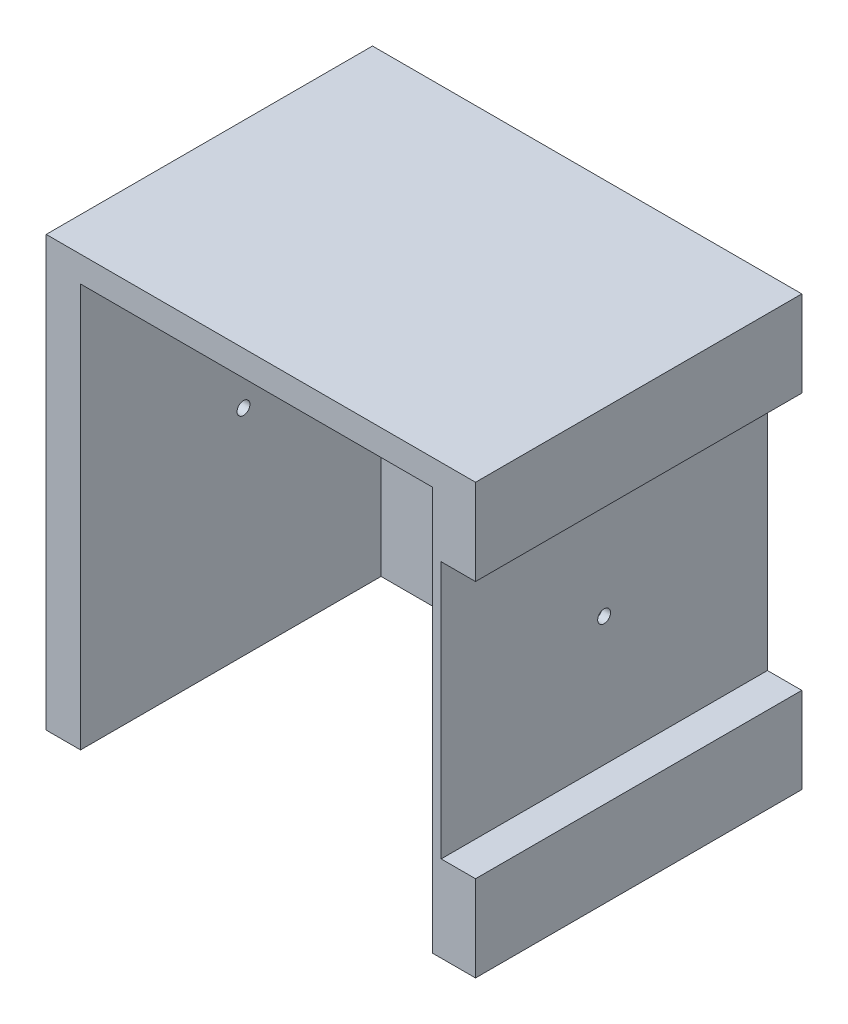
ISO-10303-21;
HEADER;
FILE_DESCRIPTION(('STEP AP214'),'2;1');
FILE_NAME('part.step','',(''),(''),'','','');
FILE_SCHEMA(('AUTOMOTIVE_DESIGN { 1 0 10303 214 1 1 1 1 }'));
ENDSEC;
DATA;
#1=APPLICATION_CONTEXT('core data for automotive mechanical design processes');
#2=APPLICATION_PROTOCOL_DEFINITION('international standard','automotive_design',2000,#1);
#3=PRODUCT_CONTEXT('',#1,'mechanical');
#4=PRODUCT('Part','Part','',(#3));
#5=PRODUCT_RELATED_PRODUCT_CATEGORY('part','',(#4));
#6=PRODUCT_DEFINITION_FORMATION('','',#4);
#7=PRODUCT_DEFINITION_CONTEXT('part definition',#1,'design');
#8=PRODUCT_DEFINITION('design','',#6,#7);
#9=PRODUCT_DEFINITION_SHAPE('','',#8);
#10=(LENGTH_UNIT() NAMED_UNIT(*) SI_UNIT(.MILLI.,.METRE.));
#11=(NAMED_UNIT(*) PLANE_ANGLE_UNIT() SI_UNIT($,.RADIAN.));
#12=(NAMED_UNIT(*) SI_UNIT($,.STERADIAN.) SOLID_ANGLE_UNIT());
#13=UNCERTAINTY_MEASURE_WITH_UNIT(LENGTH_MEASURE(1.E-05),#10,'distance_accuracy_value','');
#14=(GEOMETRIC_REPRESENTATION_CONTEXT(3) GLOBAL_UNCERTAINTY_ASSIGNED_CONTEXT((#13)) GLOBAL_UNIT_ASSIGNED_CONTEXT((#10,
#11,#12)) REPRESENTATION_CONTEXT('',''));
#15=CARTESIAN_POINT('',(0.,0.,0.));
#16=DIRECTION('',(0.,0.,1.));
#17=DIRECTION('',(1.,0.,0.));
#18=AXIS2_PLACEMENT_3D('',#15,#16,#17);
#19=CARTESIAN_POINT('',(25.,25.,3.));
#20=DIRECTION('',(-1.,0.,0.));
#21=DIRECTION('',(0.,-1.,0.));
#22=AXIS2_PLACEMENT_3D('',#19,#20,#21);
#23=PLANE('',#22);
#24=DIRECTION('',(0.,0.,-1.));
#25=VECTOR('',#24,1.);
#26=CARTESIAN_POINT('',(25.,14.9878324931505,0.));
#27=LINE('',#26,#25);
#28=CARTESIAN_POINT('',(25.,14.9878324931505,38.));
#29=VERTEX_POINT('',#28);
#30=CARTESIAN_POINT('',(25.,14.9878324931505,0.));
#31=VERTEX_POINT('',#30);
#32=EDGE_CURVE('E143',#29,#31,#27,.T.);
#33=ORIENTED_EDGE('',*,*,#32,.T.);
#34=DIRECTION('',(0.,1.,0.));
#35=VECTOR('',#34,1.);
#36=CARTESIAN_POINT('',(25.,25.,0.));
#37=LINE('',#36,#35);
#38=CARTESIAN_POINT('',(25.,25.,0.));
#39=VERTEX_POINT('',#38);
#40=EDGE_CURVE('E191',#31,#39,#37,.T.);
#41=ORIENTED_EDGE('',*,*,#40,.T.);
#42=DIRECTION('',(0.,0.,-1.));
#43=VECTOR('',#42,1.);
#44=CARTESIAN_POINT('',(25.,25.,3.));
#45=LINE('',#44,#43);
#46=CARTESIAN_POINT('',(25.,25.,38.));
#47=VERTEX_POINT('',#46);
#48=EDGE_CURVE('E46',#47,#39,#45,.T.);
#49=ORIENTED_EDGE('',*,*,#48,.F.);
#50=DIRECTION('',(0.,-1.,0.));
#51=VECTOR('',#50,1.);
#52=CARTESIAN_POINT('',(25.,25.,38.));
#53=LINE('',#52,#51);
#54=EDGE_CURVE('E179',#47,#29,#53,.T.);
#55=ORIENTED_EDGE('',*,*,#54,.T.);
#56=EDGE_LOOP('',(#33,#41,#49,#55));
#57=FACE_BOUND('',#56,.T.);
#58=ADVANCED_FACE('F37',(#57),#23,.F.);
#59=CARTESIAN_POINT('',(0.,0.,0.));
#60=DIRECTION('',(0.,0.,1.));
#61=DIRECTION('',(1.,0.,0.));
#62=AXIS2_PLACEMENT_3D('',#59,#60,#61);
#63=PLANE('',#62);
#64=DIRECTION('',(1.,0.,0.));
#65=VECTOR('',#64,1.);
#66=CARTESIAN_POINT('',(21.,14.9878324931505,0.));
#67=LINE('',#66,#65);
#68=CARTESIAN_POINT('',(21.,14.9878324931505,0.));
#69=VERTEX_POINT('',#68);
#70=EDGE_CURVE('E150',#69,#31,#67,.T.);
#71=ORIENTED_EDGE('',*,*,#70,.F.);
#72=DIRECTION('',(0.,1.,0.));
#73=VECTOR('',#72,1.);
#74=CARTESIAN_POINT('',(21.,0.,0.));
#75=LINE('',#74,#73);
#76=CARTESIAN_POINT('',(21.,-14.9878324931505,0.));
#77=VERTEX_POINT('',#76);
#78=EDGE_CURVE('E136',#77,#69,#75,.T.);
#79=ORIENTED_EDGE('',*,*,#78,.F.);
#80=DIRECTION('',(1.,0.,0.));
#81=VECTOR('',#80,1.);
#82=CARTESIAN_POINT('',(21.,-14.9878324931505,0.));
#83=LINE('',#82,#81);
#84=CARTESIAN_POINT('',(25.,-14.9878324931505,0.));
#85=VERTEX_POINT('',#84);
#86=EDGE_CURVE('E134',#77,#85,#83,.T.);
#87=ORIENTED_EDGE('',*,*,#86,.T.);
#88=CARTESIAN_POINT('',(25.,-25.,0.));
#89=VERTEX_POINT('',#88);
#90=EDGE_CURVE('E196',#89,#85,#37,.T.);
#91=ORIENTED_EDGE('',*,*,#90,.F.);
#92=DIRECTION('',(1.,0.,0.));
#93=VECTOR('',#92,1.);
#94=CARTESIAN_POINT('',(-25.,-25.,0.));
#95=LINE('',#94,#93);
#96=CARTESIAN_POINT('',(-25.,-25.,0.));
#97=VERTEX_POINT('',#96);
#98=EDGE_CURVE('E195',#97,#89,#95,.T.);
#99=ORIENTED_EDGE('',*,*,#98,.F.);
#100=DIRECTION('',(0.,-1.,0.));
#101=VECTOR('',#100,1.);
#102=CARTESIAN_POINT('',(-25.,25.,0.));
#103=LINE('',#102,#101);
#104=CARTESIAN_POINT('',(-25.,25.,0.));
#105=VERTEX_POINT('',#104);
#106=EDGE_CURVE('E201',#105,#97,#103,.T.);
#107=ORIENTED_EDGE('',*,*,#106,.F.);
#108=DIRECTION('',(-1.,0.,0.));
#109=VECTOR('',#108,1.);
#110=CARTESIAN_POINT('',(-25.,25.,0.));
#111=LINE('',#110,#109);
#112=EDGE_CURVE('E199',#39,#105,#111,.T.);
#113=ORIENTED_EDGE('',*,*,#112,.F.);
#114=ORIENTED_EDGE('',*,*,#40,.F.);
#115=EDGE_LOOP('',(#71,#79,#87,#91,#99,#107,#113,#114));
#116=FACE_BOUND('',#115,.T.);
#117=ADVANCED_FACE('F224',(#116),#63,.F.);
#118=CARTESIAN_POINT('',(20.,25.,38.));
#119=DIRECTION('',(0.,0.,1.));
#120=DIRECTION('',(0.,-1.,0.));
#121=AXIS2_PLACEMENT_3D('',#118,#119,#120);
#122=PLANE('',#121);
#123=DIRECTION('',(0.,-1.,0.));
#124=VECTOR('',#123,1.);
#125=CARTESIAN_POINT('',(21.,0.,38.));
#126=LINE('',#125,#124);
#127=CARTESIAN_POINT('',(21.,14.9878324931505,38.));
#128=VERTEX_POINT('',#127);
#129=CARTESIAN_POINT('',(21.,-14.9878324931505,38.));
#130=VERTEX_POINT('',#129);
#131=EDGE_CURVE('E137',#128,#130,#126,.T.);
#132=ORIENTED_EDGE('',*,*,#131,.F.);
#133=DIRECTION('',(1.,0.,0.));
#134=VECTOR('',#133,1.);
#135=CARTESIAN_POINT('',(21.,14.9878324931505,38.));
#136=LINE('',#135,#134);
#137=EDGE_CURVE('E159',#128,#29,#136,.T.);
#138=ORIENTED_EDGE('',*,*,#137,.T.);
#139=ORIENTED_EDGE('',*,*,#54,.F.);
#140=DIRECTION('',(1.,0.,0.));
#141=VECTOR('',#140,1.);
#142=CARTESIAN_POINT('',(20.,25.,38.));
#143=LINE('',#142,#141);
#144=CARTESIAN_POINT('',(-25.,25.,38.));
#145=VERTEX_POINT('',#144);
#146=EDGE_CURVE('E182',#145,#47,#143,.T.);
#147=ORIENTED_EDGE('',*,*,#146,.F.);
#148=DIRECTION('',(0.,1.,0.));
#149=VECTOR('',#148,1.);
#150=CARTESIAN_POINT('',(-25.,25.,38.));
#151=LINE('',#150,#149);
#152=CARTESIAN_POINT('',(-25.,-25.,38.));
#153=VERTEX_POINT('',#152);
#154=EDGE_CURVE('E164',#153,#145,#151,.T.);
#155=ORIENTED_EDGE('',*,*,#154,.F.);
#156=DIRECTION('',(-1.,0.,0.));
#157=VECTOR('',#156,1.);
#158=CARTESIAN_POINT('',(-21.,-25.,38.));
#159=LINE('',#158,#157);
#160=CARTESIAN_POINT('',(-21.,-25.,38.));
#161=VERTEX_POINT('',#160);
#162=EDGE_CURVE('E170',#161,#153,#159,.T.);
#163=ORIENTED_EDGE('',*,*,#162,.F.);
#164=DIRECTION('',(0.,1.,0.));
#165=VECTOR('',#164,1.);
#166=CARTESIAN_POINT('',(-21.,25.,38.));
#167=LINE('',#166,#165);
#168=CARTESIAN_POINT('',(-21.,22.,38.));
#169=VERTEX_POINT('',#168);
#170=EDGE_CURVE('E167',#161,#169,#167,.T.);
#171=ORIENTED_EDGE('',*,*,#170,.T.);
#172=DIRECTION('',(1.,0.,0.));
#173=VECTOR('',#172,1.);
#174=CARTESIAN_POINT('',(-25.,22.,38.));
#175=LINE('',#174,#173);
#176=CARTESIAN_POINT('',(20.,22.,38.));
#177=VERTEX_POINT('',#176);
#178=EDGE_CURVE('E155',#169,#177,#175,.T.);
#179=ORIENTED_EDGE('',*,*,#178,.T.);
#180=DIRECTION('',(0.,-1.,0.));
#181=VECTOR('',#180,1.);
#182=CARTESIAN_POINT('',(20.,25.,38.));
#183=LINE('',#182,#181);
#184=CARTESIAN_POINT('',(20.,-25.,38.));
#185=VERTEX_POINT('',#184);
#186=EDGE_CURVE('E176',#177,#185,#183,.T.);
#187=ORIENTED_EDGE('',*,*,#186,.T.);
#188=DIRECTION('',(1.,0.,0.));
#189=VECTOR('',#188,1.);
#190=CARTESIAN_POINT('',(20.,-25.,38.));
#191=LINE('',#190,#189);
#192=CARTESIAN_POINT('',(25.,-25.,38.));
#193=VERTEX_POINT('',#192);
#194=EDGE_CURVE('E185',#185,#193,#191,.T.);
#195=ORIENTED_EDGE('',*,*,#194,.T.);
#196=CARTESIAN_POINT('',(25.,-14.9878324931505,38.));
#197=VERTEX_POINT('',#196);
#198=EDGE_CURVE('E148',#197,#193,#53,.T.);
#199=ORIENTED_EDGE('',*,*,#198,.F.);
#200=DIRECTION('',(1.,0.,0.));
#201=VECTOR('',#200,1.);
#202=CARTESIAN_POINT('',(21.,-14.9878324931505,38.));
#203=LINE('',#202,#201);
#204=EDGE_CURVE('E131',#130,#197,#203,.T.);
#205=ORIENTED_EDGE('',*,*,#204,.F.);
#206=EDGE_LOOP('',(#132,#138,#139,#147,#155,#163,#171,#179,#187,#195,#199,#205));
#207=FACE_BOUND('',#206,.T.);
#208=ADVANCED_FACE('F146',(#207),#122,.T.);
#209=CARTESIAN_POINT('',(0.,0.,3.));
#210=DIRECTION('',(0.,0.,1.));
#211=DIRECTION('',(1.,0.,0.));
#212=AXIS2_PLACEMENT_3D('',#209,#210,#211);
#213=PLANE('',#212);
#214=DIRECTION('',(0.,-1.,0.));
#215=VECTOR('',#214,1.);
#216=CARTESIAN_POINT('',(20.,0.,3.));
#217=LINE('',#216,#215);
#218=CARTESIAN_POINT('',(20.,22.,3.));
#219=VERTEX_POINT('',#218);
#220=CARTESIAN_POINT('',(20.,-25.,3.));
#221=VERTEX_POINT('',#220);
#222=EDGE_CURVE('E187',#219,#221,#217,.T.);
#223=ORIENTED_EDGE('',*,*,#222,.F.);
#224=DIRECTION('',(-1.,0.,0.));
#225=VECTOR('',#224,1.);
#226=CARTESIAN_POINT('',(0.,22.,3.));
#227=LINE('',#226,#225);
#228=CARTESIAN_POINT('',(-21.,22.,3.));
#229=VERTEX_POINT('',#228);
#230=EDGE_CURVE('E158',#219,#229,#227,.T.);
#231=ORIENTED_EDGE('',*,*,#230,.T.);
#232=DIRECTION('',(0.,-1.,0.));
#233=VECTOR('',#232,1.);
#234=CARTESIAN_POINT('',(-21.,0.,3.));
#235=LINE('',#234,#233);
#236=CARTESIAN_POINT('',(-21.,-25.,3.));
#237=VERTEX_POINT('',#236);
#238=EDGE_CURVE('E61',#229,#237,#235,.T.);
#239=ORIENTED_EDGE('',*,*,#238,.T.);
#240=DIRECTION('',(1.,0.,0.));
#241=VECTOR('',#240,1.);
#242=CARTESIAN_POINT('',(-25.,-25.,3.));
#243=LINE('',#242,#241);
#244=EDGE_CURVE('E192',#237,#221,#243,.T.);
#245=ORIENTED_EDGE('',*,*,#244,.T.);
#246=EDGE_LOOP('',(#223,#231,#239,#245));
#247=FACE_BOUND('',#246,.T.);
#248=ADVANCED_FACE('F295',(#247),#213,.T.);
#249=CARTESIAN_POINT('',(20.,0.,0.));
#250=DIRECTION('',(-1.,0.,0.));
#251=DIRECTION('',(0.,-1.,0.));
#252=AXIS2_PLACEMENT_3D('',#249,#250,#251);
#253=PLANE('',#252);
#254=CARTESIAN_POINT('',(20.,0.,19.0213198186247));
#255=DIRECTION('',(-1.,0.,0.));
#256=DIRECTION('',(0.,-1.,0.));
#257=AXIS2_PLACEMENT_3D('',#254,#255,#256);
#258=CIRCLE('',#257,0.750000000000002);
#259=CARTESIAN_POINT('',(20.,-0.749999999999999,19.0213198186247));
#260=VERTEX_POINT('',#259);
#261=EDGE_CURVE('E241',#260,#260,#258,.T.);
#262=ORIENTED_EDGE('',*,*,#261,.F.);
#263=EDGE_LOOP('',(#262));
#264=FACE_BOUND('',#263,.T.);
#265=ORIENTED_EDGE('',*,*,#186,.F.);
#266=DIRECTION('',(0.,0.,-1.));
#267=VECTOR('',#266,1.);
#268=CARTESIAN_POINT('',(20.,22.,0.));
#269=LINE('',#268,#267);
#270=EDGE_CURVE('E161',#177,#219,#269,.T.);
#271=ORIENTED_EDGE('',*,*,#270,.T.);
#272=ORIENTED_EDGE('',*,*,#222,.T.);
#273=DIRECTION('',(0.,0.,-1.));
#274=VECTOR('',#273,1.);
#275=CARTESIAN_POINT('',(20.,-25.,0.));
#276=LINE('',#275,#274);
#277=EDGE_CURVE('E178',#185,#221,#276,.T.);
#278=ORIENTED_EDGE('',*,*,#277,.F.);
#279=EDGE_LOOP('',(#265,#271,#272,#278));
#280=FACE_BOUND('',#279,.T.);
#281=ADVANCED_FACE('F282',(#264,#280),#253,.T.);
#282=CARTESIAN_POINT('',(-21.,0.,0.));
#283=DIRECTION('',(-1.,0.,0.));
#284=DIRECTION('',(0.,-1.,0.));
#285=AXIS2_PLACEMENT_3D('',#282,#283,#284);
#286=PLANE('',#285);
#287=CARTESIAN_POINT('',(-21.,0.,19.0213198186247));
#288=DIRECTION('',(-1.,0.,0.));
#289=DIRECTION('',(0.,-1.,0.));
#290=AXIS2_PLACEMENT_3D('',#287,#288,#289);
#291=CIRCLE('',#290,0.750000000000002);
#292=CARTESIAN_POINT('',(-21.,-0.750000000000005,19.0213198186247));
#293=VERTEX_POINT('',#292);
#294=EDGE_CURVE('E246',#293,#293,#291,.T.);
#295=ORIENTED_EDGE('',*,*,#294,.T.);
#296=EDGE_LOOP('',(#295));
#297=FACE_BOUND('',#296,.T.);
#298=DIRECTION('',(0.,0.,-1.));
#299=VECTOR('',#298,1.);
#300=CARTESIAN_POINT('',(-21.,22.,0.));
#301=LINE('',#300,#299);
#302=EDGE_CURVE('E11',#169,#229,#301,.T.);
#303=ORIENTED_EDGE('',*,*,#302,.F.);
#304=ORIENTED_EDGE('',*,*,#170,.F.);
#305=DIRECTION('',(0.,0.,1.));
#306=VECTOR('',#305,1.);
#307=CARTESIAN_POINT('',(-21.,-25.,0.));
#308=LINE('',#307,#306);
#309=EDGE_CURVE('E165',#237,#161,#308,.T.);
#310=ORIENTED_EDGE('',*,*,#309,.F.);
#311=ORIENTED_EDGE('',*,*,#238,.F.);
#312=EDGE_LOOP('',(#303,#304,#310,#311));
#313=FACE_BOUND('',#312,.T.);
#314=ADVANCED_FACE('F276',(#297,#313),#286,.F.);
#315=ORIENTED_EDGE('',*,*,#90,.T.);
#316=DIRECTION('',(0.,0.,-1.));
#317=VECTOR('',#316,1.);
#318=CARTESIAN_POINT('',(25.,-14.9878324931505,0.));
#319=LINE('',#318,#317);
#320=EDGE_CURVE('E240',#197,#85,#319,.T.);
#321=ORIENTED_EDGE('',*,*,#320,.F.);
#322=ORIENTED_EDGE('',*,*,#198,.T.);
#323=DIRECTION('',(0.,0.,-1.));
#324=VECTOR('',#323,1.);
#325=CARTESIAN_POINT('',(25.,-25.,3.));
#326=LINE('',#325,#324);
#327=EDGE_CURVE('E194',#193,#89,#326,.T.);
#328=ORIENTED_EDGE('',*,*,#327,.T.);
#329=EDGE_LOOP('',(#315,#321,#322,#328));
#330=FACE_BOUND('',#329,.T.);
#331=ADVANCED_FACE('F39',(#330),#23,.F.);
#332=CARTESIAN_POINT('',(-25.,25.,3.));
#333=DIRECTION('',(0.,-1.,0.));
#334=DIRECTION('',(0.,0.,-1.));
#335=AXIS2_PLACEMENT_3D('',#332,#333,#334);
#336=PLANE('',#335);
#337=DIRECTION('',(0.,0.,-1.));
#338=VECTOR('',#337,1.);
#339=CARTESIAN_POINT('',(-25.,25.,3.));
#340=LINE('',#339,#338);
#341=EDGE_CURVE('E209',#145,#105,#340,.T.);
#342=ORIENTED_EDGE('',*,*,#341,.F.);
#343=ORIENTED_EDGE('',*,*,#146,.T.);
#344=ORIENTED_EDGE('',*,*,#48,.T.);
#345=ORIENTED_EDGE('',*,*,#112,.T.);
#346=EDGE_LOOP('',(#342,#343,#344,#345));
#347=FACE_BOUND('',#346,.T.);
#348=ADVANCED_FACE('F215',(#347),#336,.F.);
#349=CARTESIAN_POINT('',(-25.,25.,3.));
#350=DIRECTION('',(1.,0.,0.));
#351=DIRECTION('',(0.,1.,0.));
#352=AXIS2_PLACEMENT_3D('',#349,#350,#351);
#353=PLANE('',#352);
#354=CARTESIAN_POINT('',(-25.,0.,19.0213198186247));
#355=DIRECTION('',(-1.,0.,0.));
#356=DIRECTION('',(0.,-1.,0.));
#357=AXIS2_PLACEMENT_3D('',#354,#355,#356);
#358=CIRCLE('',#357,0.750000000000002);
#359=CARTESIAN_POINT('',(-25.,-0.750000000000005,19.0213198186247));
#360=VERTEX_POINT('',#359);
#361=EDGE_CURVE('E249',#360,#360,#358,.T.);
#362=ORIENTED_EDGE('',*,*,#361,.F.);
#363=EDGE_LOOP('',(#362));
#364=FACE_BOUND('',#363,.T.);
#365=ORIENTED_EDGE('',*,*,#106,.T.);
#366=DIRECTION('',(0.,0.,-1.));
#367=VECTOR('',#366,1.);
#368=CARTESIAN_POINT('',(-25.,-25.,3.));
#369=LINE('',#368,#367);
#370=EDGE_CURVE('E206',#153,#97,#369,.T.);
#371=ORIENTED_EDGE('',*,*,#370,.F.);
#372=ORIENTED_EDGE('',*,*,#154,.T.);
#373=ORIENTED_EDGE('',*,*,#341,.T.);
#374=EDGE_LOOP('',(#365,#371,#372,#373));
#375=FACE_BOUND('',#374,.T.);
#376=ADVANCED_FACE('F228',(#364,#375),#353,.F.);
#377=CARTESIAN_POINT('',(-25.,-25.,3.));
#378=DIRECTION('',(0.,1.,0.));
#379=DIRECTION('',(0.,0.,1.));
#380=AXIS2_PLACEMENT_3D('',#377,#378,#379);
#381=PLANE('',#380);
#382=ORIENTED_EDGE('',*,*,#98,.T.);
#383=ORIENTED_EDGE('',*,*,#327,.F.);
#384=ORIENTED_EDGE('',*,*,#194,.F.);
#385=ORIENTED_EDGE('',*,*,#277,.T.);
#386=ORIENTED_EDGE('',*,*,#244,.F.);
#387=ORIENTED_EDGE('',*,*,#309,.T.);
#388=ORIENTED_EDGE('',*,*,#162,.T.);
#389=ORIENTED_EDGE('',*,*,#370,.T.);
#390=EDGE_LOOP('',(#382,#383,#384,#385,#386,#387,#388,#389));
#391=FACE_BOUND('',#390,.T.);
#392=ADVANCED_FACE('F230',(#391),#381,.F.);
#393=CARTESIAN_POINT('',(0.,22.,0.));
#394=DIRECTION('',(0.,1.,0.));
#395=DIRECTION('',(0.,0.,1.));
#396=AXIS2_PLACEMENT_3D('',#393,#394,#395);
#397=PLANE('',#396);
#398=ORIENTED_EDGE('',*,*,#270,.F.);
#399=ORIENTED_EDGE('',*,*,#178,.F.);
#400=ORIENTED_EDGE('',*,*,#302,.T.);
#401=ORIENTED_EDGE('',*,*,#230,.F.);
#402=EDGE_LOOP('',(#398,#399,#400,#401));
#403=FACE_BOUND('',#402,.T.);
#404=ADVANCED_FACE('F286',(#403),#397,.F.);
#405=CARTESIAN_POINT('',(21.,14.9878324931505,0.));
#406=DIRECTION('',(0.,-1.,0.));
#407=DIRECTION('',(1.,0.,0.));
#408=AXIS2_PLACEMENT_3D('',#405,#406,#407);
#409=PLANE('',#408);
#410=ORIENTED_EDGE('',*,*,#32,.F.);
#411=ORIENTED_EDGE('',*,*,#137,.F.);
#412=DIRECTION('',(0.,0.,-1.));
#413=VECTOR('',#412,1.);
#414=CARTESIAN_POINT('',(21.,14.9878324931505,0.));
#415=LINE('',#414,#413);
#416=EDGE_CURVE('E53',#128,#69,#415,.T.);
#417=ORIENTED_EDGE('',*,*,#416,.T.);
#418=ORIENTED_EDGE('',*,*,#70,.T.);
#419=EDGE_LOOP('',(#410,#411,#417,#418));
#420=FACE_BOUND('',#419,.T.);
#421=ADVANCED_FACE('F267',(#420),#409,.T.);
#422=CARTESIAN_POINT('',(21.,-14.9878324931505,0.));
#423=DIRECTION('',(0.,-1.,0.));
#424=DIRECTION('',(1.,0.,0.));
#425=AXIS2_PLACEMENT_3D('',#422,#423,#424);
#426=PLANE('',#425);
#427=ORIENTED_EDGE('',*,*,#320,.T.);
#428=ORIENTED_EDGE('',*,*,#86,.F.);
#429=DIRECTION('',(0.,0.,-1.));
#430=VECTOR('',#429,1.);
#431=CARTESIAN_POINT('',(21.,-14.9878324931505,0.));
#432=LINE('',#431,#430);
#433=EDGE_CURVE('E128',#130,#77,#432,.T.);
#434=ORIENTED_EDGE('',*,*,#433,.F.);
#435=ORIENTED_EDGE('',*,*,#204,.T.);
#436=EDGE_LOOP('',(#427,#428,#434,#435));
#437=FACE_BOUND('',#436,.T.);
#438=ADVANCED_FACE('F129',(#437),#426,.F.);
#439=CARTESIAN_POINT('',(21.,0.,0.));
#440=DIRECTION('',(1.,0.,0.));
#441=DIRECTION('',(0.,1.,0.));
#442=AXIS2_PLACEMENT_3D('',#439,#440,#441);
#443=PLANE('',#442);
#444=CARTESIAN_POINT('',(21.,0.,19.0213198186247));
#445=DIRECTION('',(1.,0.,0.));
#446=DIRECTION('',(0.,1.,0.));
#447=AXIS2_PLACEMENT_3D('',#444,#445,#446);
#448=CIRCLE('',#447,0.750000000000002);
#449=CARTESIAN_POINT('',(21.,0.750000000000005,19.0213198186247));
#450=VERTEX_POINT('',#449);
#451=EDGE_CURVE('E41',#450,#450,#448,.T.);
#452=ORIENTED_EDGE('',*,*,#451,.F.);
#453=EDGE_LOOP('',(#452));
#454=FACE_BOUND('',#453,.T.);
#455=ORIENTED_EDGE('',*,*,#131,.T.);
#456=ORIENTED_EDGE('',*,*,#433,.T.);
#457=ORIENTED_EDGE('',*,*,#78,.T.);
#458=ORIENTED_EDGE('',*,*,#416,.F.);
#459=EDGE_LOOP('',(#455,#456,#457,#458));
#460=FACE_BOUND('',#459,.T.);
#461=ADVANCED_FACE('F140',(#454,#460),#443,.T.);
#462=CARTESIAN_POINT('',(43.,0.,19.0213198186247));
#463=DIRECTION('',(-1.,0.,0.));
#464=DIRECTION('',(0.,-1.,0.));
#465=AXIS2_PLACEMENT_3D('',#462,#463,#464);
#466=CYLINDRICAL_SURFACE('',#465,0.750000000000002);
#467=ORIENTED_EDGE('',*,*,#261,.T.);
#468=EDGE_LOOP('',(#467));
#469=FACE_BOUND('',#468,.T.);
#470=ORIENTED_EDGE('',*,*,#451,.T.);
#471=EDGE_LOOP('',(#470));
#472=FACE_BOUND('',#471,.T.);
#473=ADVANCED_FACE('F256',(#469,#472),#466,.F.);
#474=ORIENTED_EDGE('',*,*,#361,.T.);
#475=EDGE_LOOP('',(#474));
#476=FACE_BOUND('',#475,.T.);
#477=ORIENTED_EDGE('',*,*,#294,.F.);
#478=EDGE_LOOP('',(#477));
#479=FACE_BOUND('',#478,.T.);
#480=ADVANCED_FACE('F264',(#476,#479),#466,.F.);
#481=CLOSED_SHELL('',(#58,#117,#208,#248,#281,#314,#331,#348,#376,#392,#404,#421,#438,#461,#473,#480));
#482=MANIFOLD_SOLID_BREP('B2',#481);
#483=ADVANCED_BREP_SHAPE_REPRESENTATION('',(#18,#482),#14);
#484=SHAPE_DEFINITION_REPRESENTATION(#9,#483);
ENDSEC;
END-ISO-10303-21;
